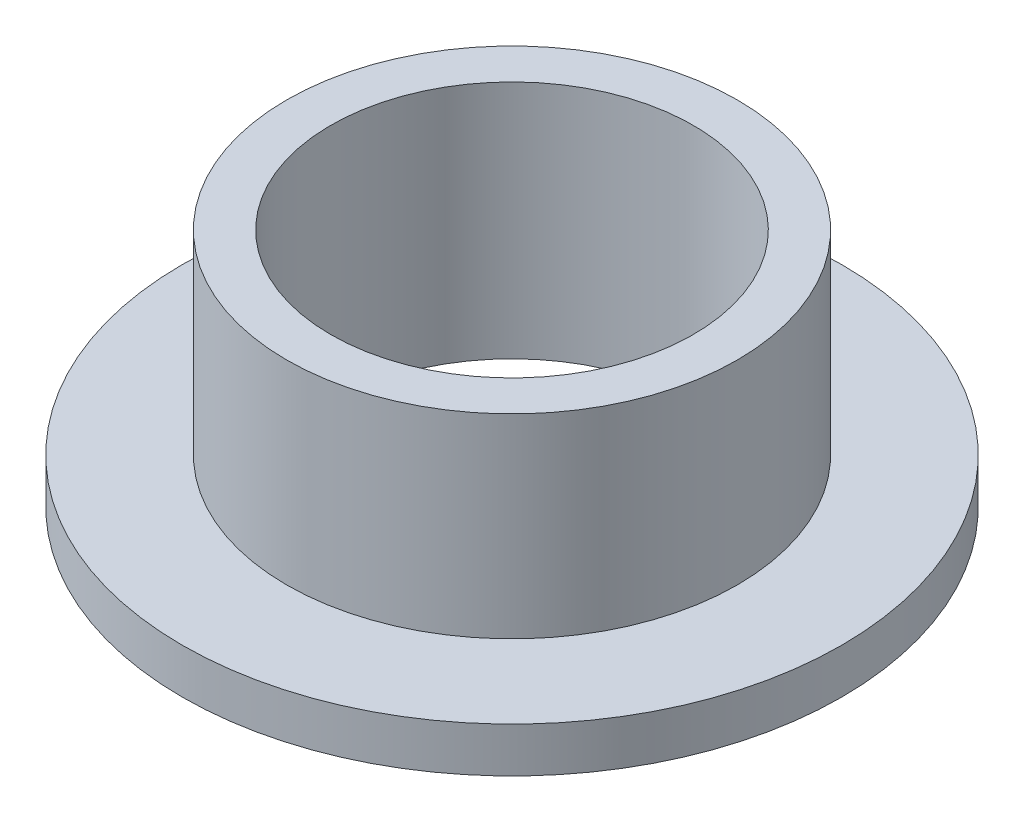
ISO-10303-21;
HEADER;
FILE_DESCRIPTION(('STEP AP214'),'2;1');
FILE_NAME('part.step','',(''),(''),'','','');
FILE_SCHEMA(('AUTOMOTIVE_DESIGN { 1 0 10303 214 1 1 1 1 }'));
ENDSEC;
DATA;
#1=APPLICATION_CONTEXT('core data for automotive mechanical design processes');
#2=APPLICATION_PROTOCOL_DEFINITION('international standard','automotive_design',2000,#1);
#3=PRODUCT_CONTEXT('',#1,'mechanical');
#4=PRODUCT('Part','Part','',(#3));
#5=PRODUCT_RELATED_PRODUCT_CATEGORY('part','',(#4));
#6=PRODUCT_DEFINITION_FORMATION('','',#4);
#7=PRODUCT_DEFINITION_CONTEXT('part definition',#1,'design');
#8=PRODUCT_DEFINITION('design','',#6,#7);
#9=PRODUCT_DEFINITION_SHAPE('','',#8);
#10=(LENGTH_UNIT() NAMED_UNIT(*) SI_UNIT(.MILLI.,.METRE.));
#11=(NAMED_UNIT(*) PLANE_ANGLE_UNIT() SI_UNIT($,.RADIAN.));
#12=(NAMED_UNIT(*) SI_UNIT($,.STERADIAN.) SOLID_ANGLE_UNIT());
#13=UNCERTAINTY_MEASURE_WITH_UNIT(LENGTH_MEASURE(1.E-05),#10,'distance_accuracy_value','');
#14=(GEOMETRIC_REPRESENTATION_CONTEXT(3) GLOBAL_UNCERTAINTY_ASSIGNED_CONTEXT((#13)) GLOBAL_UNIT_ASSIGNED_CONTEXT((#10,
#11,#12)) REPRESENTATION_CONTEXT('',''));
#15=CARTESIAN_POINT('',(0.,0.,0.));
#16=DIRECTION('',(0.,0.,1.));
#17=DIRECTION('',(1.,0.,0.));
#18=AXIS2_PLACEMENT_3D('',#15,#16,#17);
#19=CARTESIAN_POINT('',(0.,6.35,0.));
#20=DIRECTION('',(0.,1.,0.));
#21=DIRECTION('',(0.,0.,1.));
#22=AXIS2_PLACEMENT_3D('',#19,#20,#21);
#23=PLANE('',#22);
#24=CARTESIAN_POINT('',(0.,6.35,0.));
#25=DIRECTION('',(0.,1.,0.));
#26=DIRECTION('',(0.,0.,1.));
#27=AXIS2_PLACEMENT_3D('',#24,#25,#26);
#28=CIRCLE('',#27,5.96646);
#29=CARTESIAN_POINT('',(0.,6.35,5.96646));
#30=VERTEX_POINT('',#29);
#31=EDGE_CURVE('E10',#30,#30,#28,.T.);
#32=ORIENTED_EDGE('',*,*,#31,.T.);
#33=EDGE_LOOP('',(#32));
#34=FACE_BOUND('',#33,.T.);
#35=CARTESIAN_POINT('',(0.,6.35,0.));
#36=DIRECTION('',(0.,1.,0.));
#37=DIRECTION('',(0.,0.,1.));
#38=AXIS2_PLACEMENT_3D('',#35,#36,#37);
#39=CIRCLE('',#38,4.8006);
#40=CARTESIAN_POINT('',(0.,6.35,4.8006));
#41=VERTEX_POINT('',#40);
#42=EDGE_CURVE('E38',#41,#41,#39,.T.);
#43=ORIENTED_EDGE('',*,*,#42,.F.);
#44=EDGE_LOOP('',(#43));
#45=FACE_BOUND('',#44,.T.);
#46=ADVANCED_FACE('F31',(#34,#45),#23,.T.);
#47=CARTESIAN_POINT('',(0.,0.,0.));
#48=DIRECTION('',(0.,1.,0.));
#49=DIRECTION('',(0.,0.,1.));
#50=AXIS2_PLACEMENT_3D('',#47,#48,#49);
#51=PLANE('',#50);
#52=CARTESIAN_POINT('',(0.,0.,0.));
#53=DIRECTION('',(0.,1.,0.));
#54=DIRECTION('',(0.,0.,1.));
#55=AXIS2_PLACEMENT_3D('',#52,#53,#54);
#56=CIRCLE('',#55,4.8006);
#57=CARTESIAN_POINT('',(0.,0.,4.8006));
#58=VERTEX_POINT('',#57);
#59=EDGE_CURVE('E42',#58,#58,#56,.T.);
#60=ORIENTED_EDGE('',*,*,#59,.T.);
#61=EDGE_LOOP('',(#60));
#62=FACE_BOUND('',#61,.T.);
#63=CARTESIAN_POINT('',(0.,0.,0.));
#64=DIRECTION('',(0.,1.,0.));
#65=DIRECTION('',(0.,0.,1.));
#66=AXIS2_PLACEMENT_3D('',#63,#64,#65);
#67=CIRCLE('',#66,8.73125);
#68=CARTESIAN_POINT('',(0.,0.,-8.73125));
#69=VERTEX_POINT('',#68);
#70=EDGE_CURVE('E49',#69,#69,#67,.T.);
#71=ORIENTED_EDGE('',*,*,#70,.F.);
#72=EDGE_LOOP('',(#71));
#73=FACE_BOUND('',#72,.T.);
#74=ADVANCED_FACE('F74',(#62,#73),#51,.F.);
#75=CARTESIAN_POINT('',(0.,6.35,0.));
#76=DIRECTION('',(0.,-1.,0.));
#77=DIRECTION('',(0.,0.,-1.));
#78=AXIS2_PLACEMENT_3D('',#75,#76,#77);
#79=CYLINDRICAL_SURFACE('',#78,5.96646);
#80=CARTESIAN_POINT('',(0.,1.190625,0.));
#81=DIRECTION('',(0.,1.,0.));
#82=DIRECTION('',(0.,0.,1.));
#83=AXIS2_PLACEMENT_3D('',#80,#81,#82);
#84=CIRCLE('',#83,5.96646);
#85=CARTESIAN_POINT('',(0.,1.190625,5.96646));
#86=VERTEX_POINT('',#85);
#87=EDGE_CURVE('E52',#86,#86,#84,.T.);
#88=ORIENTED_EDGE('',*,*,#87,.T.);
#89=EDGE_LOOP('',(#88));
#90=FACE_BOUND('',#89,.T.);
#91=ORIENTED_EDGE('',*,*,#31,.F.);
#92=EDGE_LOOP('',(#91));
#93=FACE_BOUND('',#92,.T.);
#94=ADVANCED_FACE('F33',(#90,#93),#79,.T.);
#95=CARTESIAN_POINT('',(0.,6.35,0.));
#96=DIRECTION('',(0.,-1.,0.));
#97=DIRECTION('',(0.,0.,-1.));
#98=AXIS2_PLACEMENT_3D('',#95,#96,#97);
#99=CYLINDRICAL_SURFACE('',#98,4.8006);
#100=ORIENTED_EDGE('',*,*,#42,.T.);
#101=EDGE_LOOP('',(#100));
#102=FACE_BOUND('',#101,.T.);
#103=ORIENTED_EDGE('',*,*,#59,.F.);
#104=EDGE_LOOP('',(#103));
#105=FACE_BOUND('',#104,.T.);
#106=ADVANCED_FACE('F63',(#102,#105),#99,.F.);
#107=CARTESIAN_POINT('',(0.,1.190625,0.));
#108=DIRECTION('',(0.,1.,0.));
#109=DIRECTION('',(0.,0.,1.));
#110=AXIS2_PLACEMENT_3D('',#107,#108,#109);
#111=PLANE('',#110);
#112=CARTESIAN_POINT('',(0.,1.190625,0.));
#113=DIRECTION('',(0.,1.,0.));
#114=DIRECTION('',(0.,0.,1.));
#115=AXIS2_PLACEMENT_3D('',#112,#113,#114);
#116=CIRCLE('',#115,8.73125);
#117=CARTESIAN_POINT('',(0.,1.190625,-8.73125));
#118=VERTEX_POINT('',#117);
#119=EDGE_CURVE('E47',#118,#118,#116,.T.);
#120=ORIENTED_EDGE('',*,*,#119,.T.);
#121=EDGE_LOOP('',(#120));
#122=FACE_BOUND('',#121,.T.);
#123=ORIENTED_EDGE('',*,*,#87,.F.);
#124=EDGE_LOOP('',(#123));
#125=FACE_BOUND('',#124,.T.);
#126=ADVANCED_FACE('F60',(#122,#125),#111,.T.);
#127=CARTESIAN_POINT('',(0.,1.190625,0.));
#128=DIRECTION('',(0.,-1.,0.));
#129=DIRECTION('',(0.,0.,-1.));
#130=AXIS2_PLACEMENT_3D('',#127,#128,#129);
#131=CYLINDRICAL_SURFACE('',#130,8.73125);
#132=CARTESIAN_POINT('',(0.,1.190625,-8.73125));
#133=CARTESIAN_POINT('',(0.,1.17822265625,-8.73125));
#134=CARTESIAN_POINT('',(0.,1.1658203125,-8.73125));
#135=CARTESIAN_POINT('',(0.,1.141015625,-8.73125));
#136=CARTESIAN_POINT('',(0.,1.12861328125,-8.73125));
#137=CARTESIAN_POINT('',(0.,1.10380859375,-8.73125));
#138=CARTESIAN_POINT('',(0.,1.09140625,-8.73125));
#139=CARTESIAN_POINT('',(0.,1.0666015625,-8.73125));
#140=CARTESIAN_POINT('',(0.,1.05419921875,-8.73125));
#141=CARTESIAN_POINT('',(0.,1.02939453125,-8.73125));
#142=CARTESIAN_POINT('',(0.,1.0169921875,-8.73125));
#143=CARTESIAN_POINT('',(0.,0.9921875,-8.73125));
#144=CARTESIAN_POINT('',(0.,0.97978515625,-8.73125));
#145=CARTESIAN_POINT('',(0.,0.95498046875,-8.73125));
#146=CARTESIAN_POINT('',(0.,0.942578125,-8.73125));
#147=CARTESIAN_POINT('',(0.,0.9177734375,-8.73125));
#148=CARTESIAN_POINT('',(0.,0.90537109375,-8.73125));
#149=CARTESIAN_POINT('',(0.,0.88056640625,-8.73125));
#150=CARTESIAN_POINT('',(0.,0.8681640625,-8.73125));
#151=CARTESIAN_POINT('',(0.,0.843359375,-8.73125));
#152=CARTESIAN_POINT('',(0.,0.83095703125,-8.73125));
#153=CARTESIAN_POINT('',(0.,0.80615234375,-8.73125));
#154=CARTESIAN_POINT('',(0.,0.79375,-8.73125));
#155=CARTESIAN_POINT('',(0.,0.7689453125,-8.73125));
#156=CARTESIAN_POINT('',(0.,0.75654296875,-8.73125));
#157=CARTESIAN_POINT('',(0.,0.73173828125,-8.73125));
#158=CARTESIAN_POINT('',(0.,0.7193359375,-8.73125));
#159=CARTESIAN_POINT('',(0.,0.69453125,-8.73125));
#160=CARTESIAN_POINT('',(0.,0.68212890625,-8.73125));
#161=CARTESIAN_POINT('',(0.,0.65732421875,-8.73125));
#162=CARTESIAN_POINT('',(0.,0.644921875,-8.73125));
#163=CARTESIAN_POINT('',(0.,0.6201171875,-8.73125));
#164=CARTESIAN_POINT('',(0.,0.60771484375,-8.73125));
#165=CARTESIAN_POINT('',(0.,0.58291015625,-8.73125));
#166=CARTESIAN_POINT('',(0.,0.5705078125,-8.73125));
#167=CARTESIAN_POINT('',(0.,0.545703125,-8.73125));
#168=CARTESIAN_POINT('',(0.,0.53330078125,-8.73125));
#169=CARTESIAN_POINT('',(0.,0.50849609375,-8.73125));
#170=CARTESIAN_POINT('',(0.,0.49609375,-8.73125));
#171=CARTESIAN_POINT('',(0.,0.4712890625,-8.73125));
#172=CARTESIAN_POINT('',(0.,0.45888671875,-8.73125));
#173=CARTESIAN_POINT('',(0.,0.43408203125,-8.73125));
#174=CARTESIAN_POINT('',(0.,0.4216796875,-8.73125));
#175=CARTESIAN_POINT('',(0.,0.396875,-8.73125));
#176=CARTESIAN_POINT('',(0.,0.38447265625,-8.73125));
#177=CARTESIAN_POINT('',(0.,0.35966796875,-8.73125));
#178=CARTESIAN_POINT('',(0.,0.347265625,-8.73125));
#179=CARTESIAN_POINT('',(0.,0.3224609375,-8.73125));
#180=CARTESIAN_POINT('',(0.,0.31005859375,-8.73125));
#181=CARTESIAN_POINT('',(0.,0.28525390625,-8.73125));
#182=CARTESIAN_POINT('',(0.,0.2728515625,-8.73125));
#183=CARTESIAN_POINT('',(0.,0.248046875,-8.73125));
#184=CARTESIAN_POINT('',(0.,0.23564453125,-8.73125));
#185=CARTESIAN_POINT('',(0.,0.21083984375,-8.73125));
#186=CARTESIAN_POINT('',(0.,0.1984375,-8.73125));
#187=CARTESIAN_POINT('',(0.,0.1736328125,-8.73125));
#188=CARTESIAN_POINT('',(0.,0.16123046875,-8.73125));
#189=CARTESIAN_POINT('',(0.,0.13642578125,-8.73125));
#190=CARTESIAN_POINT('',(0.,0.1240234375,-8.73125));
#191=CARTESIAN_POINT('',(0.,0.0992187500000001,-8.73125));
#192=CARTESIAN_POINT('',(0.,0.08681640625,-8.73125));
#193=CARTESIAN_POINT('',(0.,0.06201171875,-8.73125));
#194=CARTESIAN_POINT('',(0.,0.049609375,-8.73125));
#195=CARTESIAN_POINT('',(0.,0.0248046875,-8.73125));
#196=CARTESIAN_POINT('',(0.,0.01240234375,-8.73125));
#197=CARTESIAN_POINT('',(0.,0.,-8.73125));
#198=B_SPLINE_CURVE_WITH_KNOTS('',3,(#132,#133,#134,#135,#136,#137,#138,#139,#140,#141,#142,
#143,#144,#145,#146,#147,#148,#149,#150,#151,#152,#153,#154,#155,#156,#157,#158,#159,#160,#161,
#162,#163,#164,#165,#166,#167,#168,#169,#170,#171,#172,#173,#174,#175,#176,#177,#178,#179,#180,
#181,#182,#183,#184,#185,#186,#187,#188,#189,#190,#191,#192,#193,#194,#195,#196,#197),
.UNSPECIFIED.,.F.,.F.,(4,2,2,2,2,2,2,2,2,2,2,2,2,2,2,2,2,2,2,2,2,2,2,2,2,2,2,2,2,2,2,2,4),(0.,
0.0372070312499998,0.0744140624999998,0.11162109375,0.148828125,0.18603515625,0.2232421875,
0.26044921875,0.29765625,0.33486328125,0.3720703125,0.40927734375,0.446484375,0.48369140625,
0.5208984375,0.55810546875,0.5953125,0.63251953125,0.6697265625,0.70693359375,0.744140625,
0.78134765625,0.8185546875,0.85576171875,0.89296875,0.93017578125,0.9673828125,1.00458984375,
1.041796875,1.07900390625,1.1162109375,1.15341796875,1.190625),.UNSPECIFIED.);
#199=EDGE_CURVE('BSEAM62',#118,#69,#198,.T.);
#200=ORIENTED_EDGE('',*,*,#119,.F.);
#201=ORIENTED_EDGE('',*,*,#70,.T.);
#202=ORIENTED_EDGE('',*,*,#199,.T.);
#203=ORIENTED_EDGE('',*,*,#199,.F.);
#204=EDGE_LOOP('',(#200,#202,#201,#203));
#205=FACE_BOUND('',#204,.T.);
#206=ADVANCED_FACE('F62',(#205),#131,.T.);
#207=CLOSED_SHELL('',(#46,#74,#94,#106,#126,#206));
#208=MANIFOLD_SOLID_BREP('B2',#207);
#209=ADVANCED_BREP_SHAPE_REPRESENTATION('',(#18,#208),#14);
#210=SHAPE_DEFINITION_REPRESENTATION(#9,#209);
ENDSEC;
END-ISO-10303-21;
